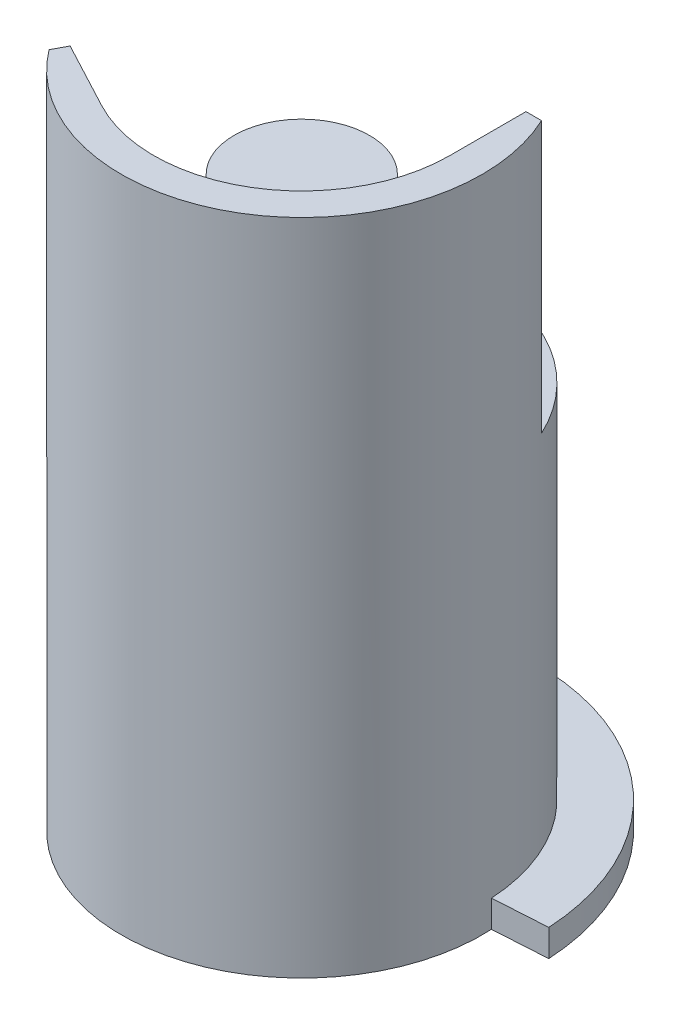
ISO-10303-21;
HEADER;
FILE_DESCRIPTION(('STEP AP214'),'2;1');
FILE_NAME('part.step','',(''),(''),'','','');
FILE_SCHEMA(('AUTOMOTIVE_DESIGN { 1 0 10303 214 1 1 1 1 }'));
ENDSEC;
DATA;
#1=APPLICATION_CONTEXT('core data for automotive mechanical design processes');
#2=APPLICATION_PROTOCOL_DEFINITION('international standard','automotive_design',2000,#1);
#3=PRODUCT_CONTEXT('',#1,'mechanical');
#4=PRODUCT('Part','Part','',(#3));
#5=PRODUCT_RELATED_PRODUCT_CATEGORY('part','',(#4));
#6=PRODUCT_DEFINITION_FORMATION('','',#4);
#7=PRODUCT_DEFINITION_CONTEXT('part definition',#1,'design');
#8=PRODUCT_DEFINITION('design','',#6,#7);
#9=PRODUCT_DEFINITION_SHAPE('','',#8);
#10=(LENGTH_UNIT() NAMED_UNIT(*) SI_UNIT(.MILLI.,.METRE.));
#11=(NAMED_UNIT(*) PLANE_ANGLE_UNIT() SI_UNIT($,.RADIAN.));
#12=(NAMED_UNIT(*) SI_UNIT($,.STERADIAN.) SOLID_ANGLE_UNIT());
#13=UNCERTAINTY_MEASURE_WITH_UNIT(LENGTH_MEASURE(1.E-05),#10,'distance_accuracy_value','');
#14=(GEOMETRIC_REPRESENTATION_CONTEXT(3) GLOBAL_UNCERTAINTY_ASSIGNED_CONTEXT((#13)) GLOBAL_UNIT_ASSIGNED_CONTEXT((#10,
#11,#12)) REPRESENTATION_CONTEXT('',''));
#15=CARTESIAN_POINT('',(0.,0.,0.));
#16=DIRECTION('',(0.,0.,1.));
#17=DIRECTION('',(1.,0.,0.));
#18=AXIS2_PLACEMENT_3D('',#15,#16,#17);
#19=CARTESIAN_POINT('',(26.3455225493203,21.5,0.));
#20=DIRECTION('',(0.,-1.,0.));
#21=DIRECTION('',(0.,0.,-1.));
#22=AXIS2_PLACEMENT_3D('',#19,#20,#21);
#23=CYLINDRICAL_SURFACE('',#22,10.);
#24=CARTESIAN_POINT('',(26.3455225493203,21.5,0.));
#25=DIRECTION('',(0.,-1.,0.));
#26=DIRECTION('',(0.,0.,1.));
#27=AXIS2_PLACEMENT_3D('',#24,#25,#26);
#28=CIRCLE('',#27,10.);
#29=CARTESIAN_POINT('',(18.3608592078682,21.5,6.02039461527813));
#30=VERTEX_POINT('',#29);
#31=CARTESIAN_POINT('',(35.4097878601718,21.5,-4.22363520850167));
#32=VERTEX_POINT('',#31);
#33=EDGE_CURVE('E12',#30,#32,#28,.T.);
#34=ORIENTED_EDGE('',*,*,#33,.T.);
#35=DIRECTION('',(0.,-1.,0.));
#36=VECTOR('',#35,1.);
#37=CARTESIAN_POINT('',(35.4097878601718,36.5,-4.22363520850167));
#38=LINE('',#37,#36);
#39=CARTESIAN_POINT('',(35.4097878601718,36.5,-4.22363520850167));
#40=VERTEX_POINT('',#39);
#41=EDGE_CURVE('E207',#40,#32,#38,.T.);
#42=ORIENTED_EDGE('',*,*,#41,.F.);
#43=CARTESIAN_POINT('',(26.3455225493203,36.5,0.));
#44=DIRECTION('',(0.,-1.,0.));
#45=DIRECTION('',(0.,0.,1.));
#46=AXIS2_PLACEMENT_3D('',#43,#44,#45);
#47=CIRCLE('',#46,10.);
#48=CARTESIAN_POINT('',(18.3608592078682,36.5,6.02039461527813));
#49=VERTEX_POINT('',#48);
#50=EDGE_CURVE('E182',#40,#49,#47,.T.);
#51=ORIENTED_EDGE('',*,*,#50,.T.);
#52=DIRECTION('',(0.,-1.,0.));
#53=VECTOR('',#52,1.);
#54=CARTESIAN_POINT('',(18.3608592078682,36.5,6.02039461527813));
#55=LINE('',#54,#53);
#56=EDGE_CURVE('E204',#49,#30,#55,.T.);
#57=ORIENTED_EDGE('',*,*,#56,.T.);
#58=EDGE_LOOP('',(#34,#42,#51,#57));
#59=FACE_BOUND('',#58,.T.);
#60=DIRECTION('',(0.,-1.,0.));
#61=VECTOR('',#60,1.);
#62=CARTESIAN_POINT('',(36.3318178968661,1.5,-0.523359562429433));
#63=LINE('',#62,#61);
#64=CARTESIAN_POINT('',(36.3318178968661,1.5,-0.523359562429433));
#65=VERTEX_POINT('',#64);
#66=CARTESIAN_POINT('',(36.3318178968661,0.,-0.523359562429433));
#67=VERTEX_POINT('',#66);
#68=EDGE_CURVE('E163',#65,#67,#63,.T.);
#69=ORIENTED_EDGE('',*,*,#68,.F.);
#70=CARTESIAN_POINT('',(26.3455225493203,1.5,0.));
#71=DIRECTION('',(0.,-1.,0.));
#72=DIRECTION('',(0.,0.,1.));
#73=AXIS2_PLACEMENT_3D('',#70,#71,#72);
#74=CIRCLE('',#73,10.);
#75=CARTESIAN_POINT('',(26.8688821117497,1.5,-9.98629534754574));
#76=VERTEX_POINT('',#75);
#77=EDGE_CURVE('E365',#76,#65,#74,.T.);
#78=ORIENTED_EDGE('',*,*,#77,.F.);
#79=DIRECTION('',(0.,-1.,0.));
#80=VECTOR('',#79,1.);
#81=CARTESIAN_POINT('',(26.8688821117497,1.5,-9.98629534754574));
#82=LINE('',#81,#80);
#83=CARTESIAN_POINT('',(26.8688821117497,0.,-9.98629534754574));
#84=VERTEX_POINT('',#83);
#85=EDGE_CURVE('E152',#76,#84,#82,.T.);
#86=ORIENTED_EDGE('',*,*,#85,.T.);
#87=CARTESIAN_POINT('',(26.3455225493203,0.,0.));
#88=DIRECTION('',(0.,-1.,0.));
#89=DIRECTION('',(0.,0.,1.));
#90=AXIS2_PLACEMENT_3D('',#87,#88,#89);
#91=CIRCLE('',#90,10.);
#92=EDGE_CURVE('E62',#67,#84,#91,.T.);
#93=ORIENTED_EDGE('',*,*,#92,.F.);
#94=EDGE_LOOP('',(#69,#78,#86,#93));
#95=FACE_BOUND('',#94,.T.);
#96=ADVANCED_FACE('F59',(#59,#95),#23,.T.);
#97=CARTESIAN_POINT('',(26.3455225493203,21.5,0.));
#98=DIRECTION('',(0.,1.,0.));
#99=DIRECTION('',(0.,0.,1.));
#100=AXIS2_PLACEMENT_3D('',#97,#98,#99);
#101=PLANE('',#100);
#102=CARTESIAN_POINT('',(26.3455225493203,21.5,0.));
#103=DIRECTION('',(0.,-1.,0.));
#104=DIRECTION('',(0.,0.,1.));
#105=AXIS2_PLACEMENT_3D('',#102,#103,#104);
#106=CIRCLE('',#105,3.75);
#107=CARTESIAN_POINT('',(26.3455225493203,21.5,3.75));
#108=VERTEX_POINT('',#107);
#109=EDGE_CURVE('E166',#108,#108,#106,.T.);
#110=ORIENTED_EDGE('',*,*,#109,.T.);
#111=EDGE_LOOP('',(#110));
#112=FACE_BOUND('',#111,.T.);
#113=DIRECTION('',(-0.882947592858924,0.,-0.469471562785896));
#114=VECTOR('',#113,1.);
#115=CARTESIAN_POINT('',(22.495855734476,21.5,7.24017026144318));
#116=LINE('',#115,#114);
#117=CARTESIAN_POINT('',(22.495855734476,21.5,7.24017026144318));
#118=VERTEX_POINT('',#117);
#119=CARTESIAN_POINT('',(18.7666071940152,21.5,5.25729363947036));
#120=VERTEX_POINT('',#119);
#121=EDGE_CURVE('E177',#118,#120,#116,.T.);
#122=ORIENTED_EDGE('',*,*,#121,.F.);
#123=CARTESIAN_POINT('',(26.3455225493203,21.5,0.));
#124=DIRECTION('',(0.,-1.,0.));
#125=DIRECTION('',(0.,0.,1.));
#126=AXIS2_PLACEMENT_3D('',#123,#124,#125);
#127=CIRCLE('',#126,8.2);
#128=CARTESIAN_POINT('',(34.5455225493203,21.5,0.));
#129=VERTEX_POINT('',#128);
#130=EDGE_CURVE('E170',#129,#118,#127,.T.);
#131=ORIENTED_EDGE('',*,*,#130,.F.);
#132=DIRECTION('',(0.,0.,-1.));
#133=VECTOR('',#132,1.);
#134=CARTESIAN_POINT('',(34.5455225493203,21.5,0.));
#135=LINE('',#134,#133);
#136=CARTESIAN_POINT('',(34.5455225493203,21.5,-4.22363520850167));
#137=VERTEX_POINT('',#136);
#138=EDGE_CURVE('E192',#129,#137,#135,.T.);
#139=ORIENTED_EDGE('',*,*,#138,.T.);
#140=DIRECTION('',(1.,0.,0.));
#141=VECTOR('',#140,1.);
#142=CARTESIAN_POINT('',(26.3455225493203,21.5,-4.22363520850167));
#143=LINE('',#142,#141);
#144=EDGE_CURVE('E195',#137,#32,#143,.T.);
#145=ORIENTED_EDGE('',*,*,#144,.T.);
#146=ORIENTED_EDGE('',*,*,#33,.F.);
#147=DIRECTION('',(-0.469471562785895,0.,0.882947592858925));
#148=VECTOR('',#147,1.);
#149=CARTESIAN_POINT('',(22.6162740088596,21.5,-1.98287662197281));
#150=LINE('',#149,#148);
#151=EDGE_CURVE('E197',#120,#30,#150,.T.);
#152=ORIENTED_EDGE('',*,*,#151,.F.);
#153=EDGE_LOOP('',(#122,#131,#139,#145,#146,#152));
#154=FACE_BOUND('',#153,.T.);
#155=ADVANCED_FACE('F226',(#112,#154),#101,.T.);
#156=CARTESIAN_POINT('',(26.3455225493203,36.5,0.));
#157=DIRECTION('',(0.,-1.,0.));
#158=DIRECTION('',(0.,0.,-1.));
#159=AXIS2_PLACEMENT_3D('',#156,#157,#158);
#160=CYLINDRICAL_SURFACE('',#159,8.2);
#161=ORIENTED_EDGE('',*,*,#130,.T.);
#162=DIRECTION('',(0.,-1.,0.));
#163=VECTOR('',#162,1.);
#164=CARTESIAN_POINT('',(22.495855734476,36.5,7.24017026144318));
#165=LINE('',#164,#163);
#166=CARTESIAN_POINT('',(22.495855734476,36.5,7.24017026144318));
#167=VERTEX_POINT('',#166);
#168=EDGE_CURVE('E189',#167,#118,#165,.T.);
#169=ORIENTED_EDGE('',*,*,#168,.F.);
#170=CARTESIAN_POINT('',(26.3455225493203,36.5,0.));
#171=DIRECTION('',(0.,-1.,0.));
#172=DIRECTION('',(0.,0.,1.));
#173=AXIS2_PLACEMENT_3D('',#170,#171,#172);
#174=CIRCLE('',#173,8.2);
#175=CARTESIAN_POINT('',(34.5455225493203,36.5,0.));
#176=VERTEX_POINT('',#175);
#177=EDGE_CURVE('E173',#176,#167,#174,.T.);
#178=ORIENTED_EDGE('',*,*,#177,.F.);
#179=DIRECTION('',(0.,-1.,0.));
#180=VECTOR('',#179,1.);
#181=CARTESIAN_POINT('',(34.5455225493203,36.5,0.));
#182=LINE('',#181,#180);
#183=EDGE_CURVE('E212',#176,#129,#182,.T.);
#184=ORIENTED_EDGE('',*,*,#183,.T.);
#185=EDGE_LOOP('',(#161,#169,#178,#184));
#186=FACE_BOUND('',#185,.T.);
#187=ADVANCED_FACE('F217',(#186),#160,.F.);
#188=CARTESIAN_POINT('',(34.5455225493203,36.5,0.));
#189=DIRECTION('',(1.,0.,0.));
#190=DIRECTION('',(0.,0.,1.));
#191=AXIS2_PLACEMENT_3D('',#188,#189,#190);
#192=PLANE('',#191);
#193=ORIENTED_EDGE('',*,*,#138,.F.);
#194=ORIENTED_EDGE('',*,*,#183,.F.);
#195=DIRECTION('',(0.,0.,-1.));
#196=VECTOR('',#195,1.);
#197=CARTESIAN_POINT('',(34.5455225493203,36.5,0.));
#198=LINE('',#197,#196);
#199=CARTESIAN_POINT('',(34.5455225493203,36.5,-4.22363520850167));
#200=VERTEX_POINT('',#199);
#201=EDGE_CURVE('E176',#176,#200,#198,.T.);
#202=ORIENTED_EDGE('',*,*,#201,.T.);
#203=DIRECTION('',(0.,-1.,0.));
#204=VECTOR('',#203,1.);
#205=CARTESIAN_POINT('',(34.5455225493203,36.5,-4.22363520850167));
#206=LINE('',#205,#204);
#207=EDGE_CURVE('E210',#200,#137,#206,.T.);
#208=ORIENTED_EDGE('',*,*,#207,.T.);
#209=EDGE_LOOP('',(#193,#194,#202,#208));
#210=FACE_BOUND('',#209,.T.);
#211=ADVANCED_FACE('F222',(#210),#192,.F.);
#212=CARTESIAN_POINT('',(26.3455225493203,36.5,-4.22363520850167));
#213=DIRECTION('',(0.,0.,1.));
#214=DIRECTION('',(-1.,0.,0.));
#215=AXIS2_PLACEMENT_3D('',#212,#213,#214);
#216=PLANE('',#215);
#217=ORIENTED_EDGE('',*,*,#144,.F.);
#218=ORIENTED_EDGE('',*,*,#207,.F.);
#219=DIRECTION('',(1.,0.,0.));
#220=VECTOR('',#219,1.);
#221=CARTESIAN_POINT('',(26.3455225493203,36.5,-4.22363520850167));
#222=LINE('',#221,#220);
#223=EDGE_CURVE('E180',#200,#40,#222,.T.);
#224=ORIENTED_EDGE('',*,*,#223,.T.);
#225=ORIENTED_EDGE('',*,*,#41,.T.);
#226=EDGE_LOOP('',(#217,#218,#224,#225));
#227=FACE_BOUND('',#226,.T.);
#228=ADVANCED_FACE('F238',(#227),#216,.F.);
#229=CARTESIAN_POINT('',(22.6162740088596,36.5,-1.98287662197281));
#230=DIRECTION('',(-0.882947592858925,0.,-0.469471562785895));
#231=DIRECTION('',(0.469471562785895,0.,-0.882947592858925));
#232=AXIS2_PLACEMENT_3D('',#229,#230,#231);
#233=PLANE('',#232);
#234=ORIENTED_EDGE('',*,*,#151,.T.);
#235=ORIENTED_EDGE('',*,*,#56,.F.);
#236=DIRECTION('',(-0.469471562785895,0.,0.882947592858925));
#237=VECTOR('',#236,1.);
#238=CARTESIAN_POINT('',(22.6162740088596,36.5,-1.98287662197281));
#239=LINE('',#238,#237);
#240=CARTESIAN_POINT('',(18.7666071940152,36.5,5.25729363947036));
#241=VERTEX_POINT('',#240);
#242=EDGE_CURVE('E185',#241,#49,#239,.T.);
#243=ORIENTED_EDGE('',*,*,#242,.F.);
#244=DIRECTION('',(0.,-1.,0.));
#245=VECTOR('',#244,1.);
#246=CARTESIAN_POINT('',(18.7666071940152,36.5,5.25729363947036));
#247=LINE('',#246,#245);
#248=EDGE_CURVE('E202',#241,#120,#247,.T.);
#249=ORIENTED_EDGE('',*,*,#248,.T.);
#250=EDGE_LOOP('',(#234,#235,#243,#249));
#251=FACE_BOUND('',#250,.T.);
#252=ADVANCED_FACE('F243',(#251),#233,.T.);
#253=CARTESIAN_POINT('',(22.495855734476,36.5,7.24017026144318));
#254=DIRECTION('',(0.469471562785896,0.,-0.882947592858924));
#255=DIRECTION('',(0.882947592858924,0.,0.469471562785896));
#256=AXIS2_PLACEMENT_3D('',#253,#254,#255);
#257=PLANE('',#256);
#258=ORIENTED_EDGE('',*,*,#121,.T.);
#259=ORIENTED_EDGE('',*,*,#248,.F.);
#260=DIRECTION('',(-0.882947592858924,0.,-0.469471562785896));
#261=VECTOR('',#260,1.);
#262=CARTESIAN_POINT('',(22.495855734476,36.5,7.24017026144318));
#263=LINE('',#262,#261);
#264=EDGE_CURVE('E187',#167,#241,#263,.T.);
#265=ORIENTED_EDGE('',*,*,#264,.F.);
#266=ORIENTED_EDGE('',*,*,#168,.T.);
#267=EDGE_LOOP('',(#258,#259,#265,#266));
#268=FACE_BOUND('',#267,.T.);
#269=ADVANCED_FACE('F231',(#268),#257,.T.);
#270=CARTESIAN_POINT('',(26.3455225493203,36.5,0.));
#271=DIRECTION('',(0.,1.,0.));
#272=DIRECTION('',(0.,0.,1.));
#273=AXIS2_PLACEMENT_3D('',#270,#271,#272);
#274=PLANE('',#273);
#275=ORIENTED_EDGE('',*,*,#177,.T.);
#276=ORIENTED_EDGE('',*,*,#264,.T.);
#277=ORIENTED_EDGE('',*,*,#242,.T.);
#278=ORIENTED_EDGE('',*,*,#50,.F.);
#279=ORIENTED_EDGE('',*,*,#223,.F.);
#280=ORIENTED_EDGE('',*,*,#201,.F.);
#281=EDGE_LOOP('',(#275,#276,#277,#278,#279,#280));
#282=FACE_BOUND('',#281,.T.);
#283=ADVANCED_FACE('F234',(#282),#274,.T.);
#284=CARTESIAN_POINT('',(26.3455225493203,31.5,0.));
#285=DIRECTION('',(0.,-1.,0.));
#286=DIRECTION('',(0.,0.,-1.));
#287=AXIS2_PLACEMENT_3D('',#284,#285,#286);
#288=CYLINDRICAL_SURFACE('',#287,3.75);
#289=CARTESIAN_POINT('',(26.3455225493203,31.5,0.));
#290=DIRECTION('',(0.,-1.,0.));
#291=DIRECTION('',(0.,0.,1.));
#292=AXIS2_PLACEMENT_3D('',#289,#290,#291);
#293=CIRCLE('',#292,3.75);
#294=CARTESIAN_POINT('',(26.3455225493203,31.5,3.75));
#295=VERTEX_POINT('',#294);
#296=EDGE_CURVE('E167',#295,#295,#293,.T.);
#297=ORIENTED_EDGE('',*,*,#296,.T.);
#298=EDGE_LOOP('',(#297));
#299=FACE_BOUND('',#298,.T.);
#300=ORIENTED_EDGE('',*,*,#109,.F.);
#301=EDGE_LOOP('',(#300));
#302=FACE_BOUND('',#301,.T.);
#303=ADVANCED_FACE('F291',(#299,#302),#288,.T.);
#304=CARTESIAN_POINT('',(26.3455225493203,31.5,0.));
#305=DIRECTION('',(0.,1.,0.));
#306=DIRECTION('',(0.,0.,1.));
#307=AXIS2_PLACEMENT_3D('',#304,#305,#306);
#308=PLANE('',#307);
#309=ORIENTED_EDGE('',*,*,#296,.F.);
#310=EDGE_LOOP('',(#309));
#311=FACE_BOUND('',#310,.T.);
#312=ADVANCED_FACE('F301',(#311),#308,.T.);
#313=CARTESIAN_POINT('',(26.3455225493203,1.5,0.));
#314=DIRECTION('',(0.,-1.,0.));
#315=DIRECTION('',(0.,0.,-1.));
#316=AXIS2_PLACEMENT_3D('',#313,#314,#315);
#317=CYLINDRICAL_SURFACE('',#316,13.);
#318=CARTESIAN_POINT('',(26.3455225493203,0.,0.));
#319=DIRECTION('',(0.,-1.,0.));
#320=DIRECTION('',(0.,0.,1.));
#321=AXIS2_PLACEMENT_3D('',#318,#319,#320);
#322=CIRCLE('',#321,13.);
#323=CARTESIAN_POINT('',(39.3262974739615,0.,-0.706740656681877));
#324=VERTEX_POINT('',#323);
#325=CARTESIAN_POINT('',(27.0258899804785,0.,-12.9821839518095));
#326=VERTEX_POINT('',#325);
#327=EDGE_CURVE('E139',#324,#326,#322,.F.);
#328=ORIENTED_EDGE('',*,*,#327,.T.);
#329=DIRECTION('',(0.,-1.,0.));
#330=VECTOR('',#329,1.);
#331=CARTESIAN_POINT('',(27.0258899804785,1.5,-12.9821839518095));
#332=LINE('',#331,#330);
#333=CARTESIAN_POINT('',(27.0258899804785,1.5,-12.9821839518095));
#334=VERTEX_POINT('',#333);
#335=EDGE_CURVE('E148',#334,#326,#332,.T.);
#336=ORIENTED_EDGE('',*,*,#335,.F.);
#337=CARTESIAN_POINT('',(26.3455225493203,1.5,0.));
#338=DIRECTION('',(0.,-1.,0.));
#339=DIRECTION('',(0.,0.,1.));
#340=AXIS2_PLACEMENT_3D('',#337,#338,#339);
#341=CIRCLE('',#340,13.);
#342=CARTESIAN_POINT('',(39.3262974739615,1.5,-0.706740656681877));
#343=VERTEX_POINT('',#342);
#344=EDGE_CURVE('E144',#343,#334,#341,.F.);
#345=ORIENTED_EDGE('',*,*,#344,.F.);
#346=DIRECTION('',(0.,-1.,0.));
#347=VECTOR('',#346,1.);
#348=CARTESIAN_POINT('',(39.3262974739615,1.5,-0.706740656681877));
#349=LINE('',#348,#347);
#350=EDGE_CURVE('E156',#343,#324,#349,.T.);
#351=ORIENTED_EDGE('',*,*,#350,.T.);
#352=EDGE_LOOP('',(#328,#336,#345,#351));
#353=FACE_BOUND('',#352,.T.);
#354=ADVANCED_FACE('F155',(#353),#317,.T.);
#355=CARTESIAN_POINT('',(26.3509036128858,1.5,0.0878688450160823));
#356=DIRECTION('',(-0.061125209358617,0.,-0.998130106138907));
#357=DIRECTION('',(0.998130106138907,0.,-0.061125209358617));
#358=AXIS2_PLACEMENT_3D('',#355,#356,#357);
#359=PLANE('',#358);
#360=DIRECTION('',(-0.998130106138907,0.,0.061125209358617));
#361=VECTOR('',#360,1.);
#362=CARTESIAN_POINT('',(26.3509036128858,0.,0.0878688450160823));
#363=LINE('',#362,#361);
#364=EDGE_CURVE('E145',#324,#67,#363,.T.);
#365=ORIENTED_EDGE('',*,*,#364,.F.);
#366=ORIENTED_EDGE('',*,*,#350,.F.);
#367=DIRECTION('',(-0.998130106138907,0.,0.061125209358617));
#368=VECTOR('',#367,1.);
#369=CARTESIAN_POINT('',(26.3509036128858,1.5,0.0878688450160823));
#370=LINE('',#369,#368);
#371=EDGE_CURVE('E73',#343,#65,#370,.T.);
#372=ORIENTED_EDGE('',*,*,#371,.T.);
#373=ORIENTED_EDGE('',*,*,#68,.T.);
#374=EDGE_LOOP('',(#365,#366,#372,#373));
#375=FACE_BOUND('',#374,.T.);
#376=ADVANCED_FACE('F339',(#375),#359,.F.);
#377=CARTESIAN_POINT('',(26.3455225493203,1.5,0.));
#378=DIRECTION('',(-0.998629534754574,0.,-0.0523359562429372));
#379=DIRECTION('',(0.0523359562429373,0.,-0.998629534754574));
#380=AXIS2_PLACEMENT_3D('',#377,#378,#379);
#381=PLANE('',#380);
#382=DIRECTION('',(-0.0523359562429372,0.,0.998629534754574));
#383=VECTOR('',#382,1.);
#384=CARTESIAN_POINT('',(26.3455225493203,0.,0.));
#385=LINE('',#384,#383);
#386=EDGE_CURVE('E135',#326,#84,#385,.T.);
#387=ORIENTED_EDGE('',*,*,#386,.T.);
#388=ORIENTED_EDGE('',*,*,#85,.F.);
#389=DIRECTION('',(-0.0523359562429372,0.,0.998629534754574));
#390=VECTOR('',#389,1.);
#391=CARTESIAN_POINT('',(26.3455225493203,1.5,0.));
#392=LINE('',#391,#390);
#393=EDGE_CURVE('E80',#334,#76,#392,.T.);
#394=ORIENTED_EDGE('',*,*,#393,.F.);
#395=ORIENTED_EDGE('',*,*,#335,.T.);
#396=EDGE_LOOP('',(#387,#388,#394,#395));
#397=FACE_BOUND('',#396,.T.);
#398=ADVANCED_FACE('F149',(#397),#381,.T.);
#399=CARTESIAN_POINT('',(26.3455225493203,1.5,0.));
#400=DIRECTION('',(0.,1.,0.));
#401=DIRECTION('',(0.,0.,1.));
#402=AXIS2_PLACEMENT_3D('',#399,#400,#401);
#403=PLANE('',#402);
#404=ORIENTED_EDGE('',*,*,#344,.T.);
#405=ORIENTED_EDGE('',*,*,#393,.T.);
#406=ORIENTED_EDGE('',*,*,#77,.T.);
#407=ORIENTED_EDGE('',*,*,#371,.F.);
#408=EDGE_LOOP('',(#404,#405,#406,#407));
#409=FACE_BOUND('',#408,.T.);
#410=ADVANCED_FACE('F318',(#409),#403,.T.);
#411=CARTESIAN_POINT('',(0.,0.,0.));
#412=DIRECTION('',(0.,-1.,0.));
#413=DIRECTION('',(0.,0.,-1.));
#414=AXIS2_PLACEMENT_3D('',#411,#412,#413);
#415=PLANE('',#414);
#416=ORIENTED_EDGE('',*,*,#364,.T.);
#417=ORIENTED_EDGE('',*,*,#92,.T.);
#418=ORIENTED_EDGE('',*,*,#386,.F.);
#419=ORIENTED_EDGE('',*,*,#327,.F.);
#420=EDGE_LOOP('',(#416,#417,#418,#419));
#421=FACE_BOUND('',#420,.T.);
#422=ADVANCED_FACE('F137',(#421),#415,.T.);
#423=CLOSED_SHELL('',(#96,#155,#187,#211,#228,#252,#269,#283,#303,#312,#354,#376,#398,#410,#422));
#424=MANIFOLD_SOLID_BREP('B2',#423);
#425=ADVANCED_BREP_SHAPE_REPRESENTATION('',(#18,#424),#14);
#426=SHAPE_DEFINITION_REPRESENTATION(#9,#425);
ENDSEC;
END-ISO-10303-21;
